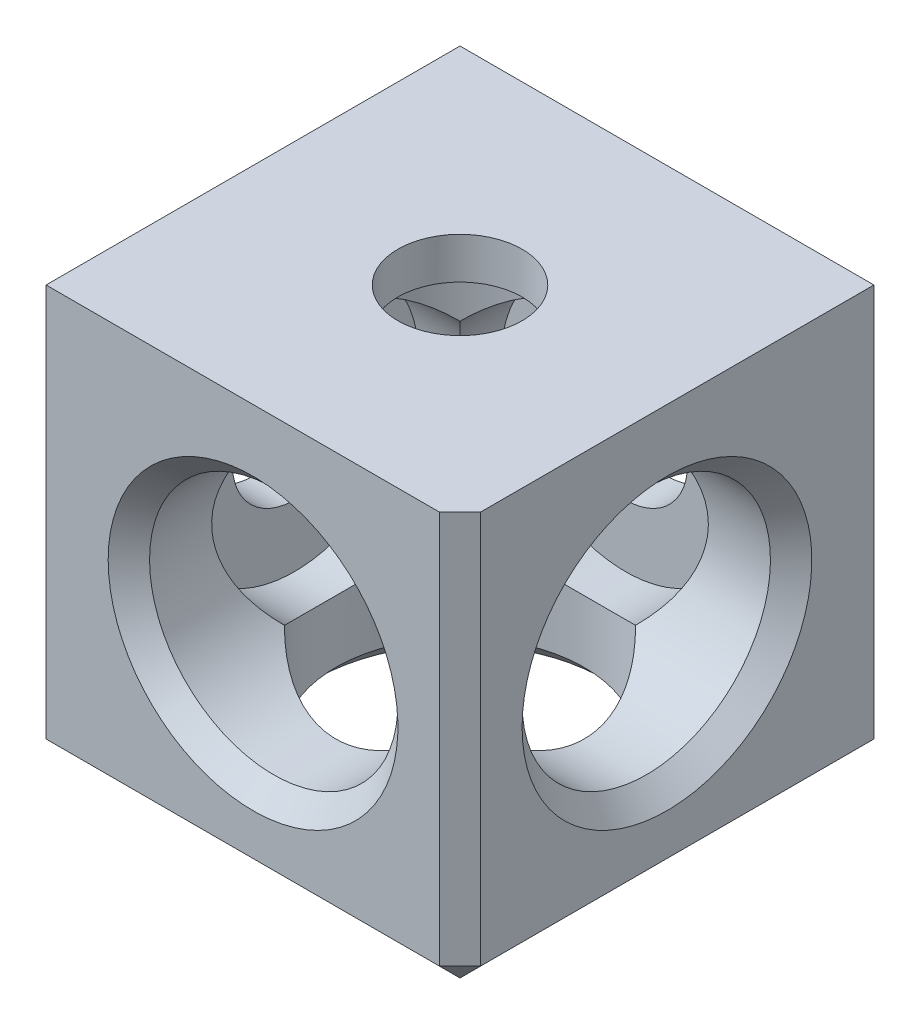
ISO-10303-21;
HEADER;
FILE_DESCRIPTION(('STEP AP214'),'2;1');
FILE_NAME('part.step','',(''),(''),'','','');
FILE_SCHEMA(('AUTOMOTIVE_DESIGN { 1 0 10303 214 1 1 1 1 }'));
ENDSEC;
DATA;
#1=APPLICATION_CONTEXT('core data for automotive mechanical design processes');
#2=APPLICATION_PROTOCOL_DEFINITION('international standard','automotive_design',2000,#1);
#3=PRODUCT_CONTEXT('',#1,'mechanical');
#4=PRODUCT('Part','Part','',(#3));
#5=PRODUCT_RELATED_PRODUCT_CATEGORY('part','',(#4));
#6=PRODUCT_DEFINITION_FORMATION('','',#4);
#7=PRODUCT_DEFINITION_CONTEXT('part definition',#1,'design');
#8=PRODUCT_DEFINITION('design','',#6,#7);
#9=PRODUCT_DEFINITION_SHAPE('','',#8);
#10=(LENGTH_UNIT() NAMED_UNIT(*) SI_UNIT(.MILLI.,.METRE.));
#11=(NAMED_UNIT(*) PLANE_ANGLE_UNIT() SI_UNIT($,.RADIAN.));
#12=(NAMED_UNIT(*) SI_UNIT($,.STERADIAN.) SOLID_ANGLE_UNIT());
#13=UNCERTAINTY_MEASURE_WITH_UNIT(LENGTH_MEASURE(1.E-05),#10,'distance_accuracy_value','');
#14=(GEOMETRIC_REPRESENTATION_CONTEXT(3) GLOBAL_UNCERTAINTY_ASSIGNED_CONTEXT((#13)) GLOBAL_UNIT_ASSIGNED_CONTEXT((#10,
#11,#12)) REPRESENTATION_CONTEXT('',''));
#15=CARTESIAN_POINT('',(0.,0.,0.));
#16=DIRECTION('',(0.,0.,1.));
#17=DIRECTION('',(1.,0.,0.));
#18=AXIS2_PLACEMENT_3D('',#15,#16,#17);
#19=CARTESIAN_POINT('',(0.,-18.4852813742386,10.));
#20=DIRECTION('',(0.,1.,0.));
#21=DIRECTION('',(0.,0.,1.));
#22=AXIS2_PLACEMENT_3D('',#19,#20,#21);
#23=CYLINDRICAL_SURFACE('',#22,3.);
#24=CARTESIAN_POINT('',(0.,10.,10.));
#25=DIRECTION('',(0.,1.,0.));
#26=DIRECTION('',(0.,0.,1.));
#27=AXIS2_PLACEMENT_3D('',#24,#25,#26);
#28=CIRCLE('',#27,3.);
#29=CARTESIAN_POINT('',(0.,10.,13.));
#30=VERTEX_POINT('',#29);
#31=EDGE_CURVE('E325',#30,#30,#28,.T.);
#32=ORIENTED_EDGE('',*,*,#31,.T.);
#33=EDGE_LOOP('',(#32));
#34=FACE_BOUND('',#33,.T.);
#35=CARTESIAN_POINT('',(0.,8.,10.));
#36=DIRECTION('',(0.,-1.,0.));
#37=DIRECTION('',(0.,0.,-1.));
#38=AXIS2_PLACEMENT_3D('',#35,#36,#37);
#39=CIRCLE('',#38,3.);
#40=CARTESIAN_POINT('',(0.,8.,7.));
#41=VERTEX_POINT('',#40);
#42=EDGE_CURVE('E161',#41,#41,#39,.F.);
#43=ORIENTED_EDGE('',*,*,#42,.F.);
#44=EDGE_LOOP('',(#43));
#45=FACE_BOUND('',#44,.T.);
#46=ADVANCED_FACE('F41',(#34,#45),#23,.F.);
#47=CARTESIAN_POINT('',(0.,0.,28.4852813742386));
#48=DIRECTION('',(0.,0.,-1.));
#49=DIRECTION('',(-1.,0.,0.));
#50=AXIS2_PLACEMENT_3D('',#47,#48,#49);
#51=CYLINDRICAL_SURFACE('',#50,3.);
#52=CARTESIAN_POINT('',(0.,0.,0.));
#53=DIRECTION('',(0.,0.,-1.));
#54=DIRECTION('',(-1.,0.,0.));
#55=AXIS2_PLACEMENT_3D('',#52,#53,#54);
#56=CIRCLE('',#55,3.);
#57=CARTESIAN_POINT('',(-3.,0.,0.));
#58=VERTEX_POINT('',#57);
#59=EDGE_CURVE('E330',#58,#58,#56,.T.);
#60=ORIENTED_EDGE('',*,*,#59,.T.);
#61=EDGE_LOOP('',(#60));
#62=FACE_BOUND('',#61,.T.);
#63=CARTESIAN_POINT('',(0.,0.,2.));
#64=DIRECTION('',(0.,0.,1.));
#65=DIRECTION('',(1.,0.,0.));
#66=AXIS2_PLACEMENT_3D('',#63,#64,#65);
#67=CIRCLE('',#66,3.);
#68=CARTESIAN_POINT('',(3.,0.,2.));
#69=VERTEX_POINT('',#68);
#70=EDGE_CURVE('E154',#69,#69,#67,.F.);
#71=ORIENTED_EDGE('',*,*,#70,.F.);
#72=EDGE_LOOP('',(#71));
#73=FACE_BOUND('',#72,.T.);
#74=ADVANCED_FACE('F217',(#62,#73),#51,.F.);
#75=CARTESIAN_POINT('',(-8.,0.,10.));
#76=DIRECTION('',(1.,0.,0.));
#77=DIRECTION('',(0.,0.,-1.));
#78=AXIS2_PLACEMENT_3D('',#75,#76,#77);
#79=CYLINDRICAL_SURFACE('',#78,6.);
#80=CARTESIAN_POINT('',(9.00000000000001,0.,10.));
#81=DIRECTION('',(-1.,0.,0.));
#82=DIRECTION('',(0.,0.,1.));
#83=AXIS2_PLACEMENT_3D('',#80,#81,#82);
#84=CIRCLE('',#83,6.);
#85=CARTESIAN_POINT('',(9.00000000000001,0.,16.));
#86=VERTEX_POINT('',#85);
#87=EDGE_CURVE('E196',#86,#86,#84,.F.);
#88=ORIENTED_EDGE('',*,*,#87,.T.);
#89=EDGE_LOOP('',(#88));
#90=FACE_BOUND('',#89,.T.);
#91=CARTESIAN_POINT('',(0.,0.,10.));
#92=DIRECTION('',(0.707106781186547,0.,-0.707106781186547));
#93=DIRECTION('',(0.707106781186547,0.,0.707106781186547));
#94=AXIS2_PLACEMENT_3D('',#91,#92,#93);
#95=ELLIPSE('',#94,8.48528137423857,6.);
#96=CARTESIAN_POINT('',(4.24264068711929,-4.24264068711928,14.2426406871193));
#97=VERTEX_POINT('',#96);
#98=CARTESIAN_POINT('',(4.24264068711929,4.24264068711928,14.2426406871193));
#99=VERTEX_POINT('',#98);
#100=EDGE_CURVE('E142',#97,#99,#95,.F.);
#101=ORIENTED_EDGE('',*,*,#100,.T.);
#102=CARTESIAN_POINT('',(0.,0.,10.));
#103=DIRECTION('',(0.707106781186547,-0.707106781186547,0.));
#104=DIRECTION('',(0.707106781186547,0.707106781186547,0.));
#105=AXIS2_PLACEMENT_3D('',#102,#103,#104);
#106=ELLIPSE('',#105,8.48528137423857,6.);
#107=CARTESIAN_POINT('',(4.24264068711928,4.24264068711928,5.75735931288071));
#108=VERTEX_POINT('',#107);
#109=EDGE_CURVE('E125',#99,#108,#106,.F.);
#110=ORIENTED_EDGE('',*,*,#109,.T.);
#111=CARTESIAN_POINT('',(0.,0.,10.));
#112=DIRECTION('',(0.707106781186547,0.,0.707106781186547));
#113=DIRECTION('',(0.707106781186547,0.,-0.707106781186547));
#114=AXIS2_PLACEMENT_3D('',#111,#112,#113);
#115=ELLIPSE('',#114,8.48528137423857,6.);
#116=CARTESIAN_POINT('',(4.24264068711928,-4.24264068711928,5.75735931288071));
#117=VERTEX_POINT('',#116);
#118=EDGE_CURVE('E134',#108,#117,#115,.F.);
#119=ORIENTED_EDGE('',*,*,#118,.T.);
#120=CARTESIAN_POINT('',(0.,0.,10.));
#121=DIRECTION('',(0.707106781186547,0.707106781186547,0.));
#122=DIRECTION('',(0.707106781186547,-0.707106781186547,0.));
#123=AXIS2_PLACEMENT_3D('',#120,#121,#122);
#124=ELLIPSE('',#123,8.48528137423857,6.);
#125=EDGE_CURVE('E311',#117,#97,#124,.F.);
#126=ORIENTED_EDGE('',*,*,#125,.T.);
#127=EDGE_LOOP('',(#101,#110,#119,#126));
#128=FACE_BOUND('',#127,.T.);
#129=ADVANCED_FACE('F139',(#90,#128),#79,.F.);
#130=CARTESIAN_POINT('',(-18.4852813742386,0.,10.));
#131=DIRECTION('',(1.,0.,0.));
#132=DIRECTION('',(0.,0.,-1.));
#133=AXIS2_PLACEMENT_3D('',#130,#131,#132);
#134=CYLINDRICAL_SURFACE('',#133,3.);
#135=CARTESIAN_POINT('',(-10.,0.,10.));
#136=DIRECTION('',(1.,0.,0.));
#137=DIRECTION('',(0.,0.,-1.));
#138=AXIS2_PLACEMENT_3D('',#135,#136,#137);
#139=CIRCLE('',#138,3.);
#140=CARTESIAN_POINT('',(-10.,0.,7.));
#141=VERTEX_POINT('',#140);
#142=EDGE_CURVE('E327',#141,#141,#139,.F.);
#143=ORIENTED_EDGE('',*,*,#142,.T.);
#144=EDGE_LOOP('',(#143));
#145=FACE_BOUND('',#144,.T.);
#146=CARTESIAN_POINT('',(-8.,0.,10.));
#147=DIRECTION('',(1.,0.,0.));
#148=DIRECTION('',(0.,0.,-1.));
#149=AXIS2_PLACEMENT_3D('',#146,#147,#148);
#150=CIRCLE('',#149,3.);
#151=CARTESIAN_POINT('',(-8.,0.,7.));
#152=VERTEX_POINT('',#151);
#153=EDGE_CURVE('E324',#152,#152,#150,.F.);
#154=ORIENTED_EDGE('',*,*,#153,.F.);
#155=EDGE_LOOP('',(#154));
#156=FACE_BOUND('',#155,.T.);
#157=ADVANCED_FACE('F233',(#145,#156),#134,.F.);
#158=CARTESIAN_POINT('',(10.,-10.,20.));
#159=DIRECTION('',(-1.,0.,0.));
#160=DIRECTION('',(0.,0.,1.));
#161=AXIS2_PLACEMENT_3D('',#158,#159,#160);
#162=PLANE('',#161);
#163=CARTESIAN_POINT('',(10.,0.,10.));
#164=DIRECTION('',(-1.,0.,0.));
#165=DIRECTION('',(0.,0.,1.));
#166=AXIS2_PLACEMENT_3D('',#163,#164,#165);
#167=CIRCLE('',#166,7.);
#168=CARTESIAN_POINT('',(10.,0.,17.));
#169=VERTEX_POINT('',#168);
#170=EDGE_CURVE('E199',#169,#169,#167,.T.);
#171=ORIENTED_EDGE('',*,*,#170,.T.);
#172=EDGE_LOOP('',(#171));
#173=FACE_BOUND('',#172,.T.);
#174=DIRECTION('',(0.,-1.,0.));
#175=VECTOR('',#174,1.);
#176=CARTESIAN_POINT('',(10.,-10.,19.));
#177=LINE('',#176,#175);
#178=CARTESIAN_POINT('',(10.,10.,19.));
#179=VERTEX_POINT('',#178);
#180=CARTESIAN_POINT('',(10.,-9.,19.));
#181=VERTEX_POINT('',#180);
#182=EDGE_CURVE('E57',#179,#181,#177,.T.);
#183=ORIENTED_EDGE('',*,*,#182,.T.);
#184=DIRECTION('',(0.,0.,-1.));
#185=VECTOR('',#184,1.);
#186=CARTESIAN_POINT('',(10.,-9.,20.));
#187=LINE('',#186,#185);
#188=CARTESIAN_POINT('',(10.,-9.,0.));
#189=VERTEX_POINT('',#188);
#190=EDGE_CURVE('E176',#181,#189,#187,.T.);
#191=ORIENTED_EDGE('',*,*,#190,.T.);
#192=DIRECTION('',(0.,1.,0.));
#193=VECTOR('',#192,1.);
#194=CARTESIAN_POINT('',(10.,-10.,0.));
#195=LINE('',#194,#193);
#196=CARTESIAN_POINT('',(10.,10.,0.));
#197=VERTEX_POINT('',#196);
#198=EDGE_CURVE('E333',#189,#197,#195,.T.);
#199=ORIENTED_EDGE('',*,*,#198,.T.);
#200=DIRECTION('',(0.,0.,-1.));
#201=VECTOR('',#200,1.);
#202=CARTESIAN_POINT('',(10.,10.,20.));
#203=LINE('',#202,#201);
#204=EDGE_CURVE('E354',#179,#197,#203,.T.);
#205=ORIENTED_EDGE('',*,*,#204,.F.);
#206=EDGE_LOOP('',(#183,#191,#199,#205));
#207=FACE_BOUND('',#206,.T.);
#208=ADVANCED_FACE('F235',(#173,#207),#162,.F.);
#209=CARTESIAN_POINT('',(-10.,10.,20.));
#210=DIRECTION('',(0.,-1.,0.));
#211=DIRECTION('',(0.,0.,-1.));
#212=AXIS2_PLACEMENT_3D('',#209,#210,#211);
#213=PLANE('',#212);
#214=ORIENTED_EDGE('',*,*,#31,.F.);
#215=EDGE_LOOP('',(#214));
#216=FACE_BOUND('',#215,.T.);
#217=DIRECTION('',(-1.,0.,0.));
#218=VECTOR('',#217,1.);
#219=CARTESIAN_POINT('',(-10.,10.,20.));
#220=LINE('',#219,#218);
#221=CARTESIAN_POINT('',(9.00000000000001,10.,20.));
#222=VERTEX_POINT('',#221);
#223=CARTESIAN_POINT('',(-10.,10.,20.));
#224=VERTEX_POINT('',#223);
#225=EDGE_CURVE('E334',#222,#224,#220,.T.);
#226=ORIENTED_EDGE('',*,*,#225,.F.);
#227=DIRECTION('',(-0.707106781186545,0.,0.70710678118655));
#228=VECTOR('',#227,1.);
#229=CARTESIAN_POINT('',(9.00000000000001,10.,20.));
#230=LINE('',#229,#228);
#231=EDGE_CURVE('E65',#222,#179,#230,.F.);
#232=ORIENTED_EDGE('',*,*,#231,.T.);
#233=ORIENTED_EDGE('',*,*,#204,.T.);
#234=DIRECTION('',(-1.,0.,0.));
#235=VECTOR('',#234,1.);
#236=CARTESIAN_POINT('',(-10.,10.,0.));
#237=LINE('',#236,#235);
#238=CARTESIAN_POINT('',(-10.,10.,0.));
#239=VERTEX_POINT('',#238);
#240=EDGE_CURVE('E343',#197,#239,#237,.T.);
#241=ORIENTED_EDGE('',*,*,#240,.T.);
#242=DIRECTION('',(0.,0.,-1.));
#243=VECTOR('',#242,1.);
#244=CARTESIAN_POINT('',(-10.,10.,20.));
#245=LINE('',#244,#243);
#246=EDGE_CURVE('E351',#224,#239,#245,.T.);
#247=ORIENTED_EDGE('',*,*,#246,.F.);
#248=EDGE_LOOP('',(#226,#232,#233,#241,#247));
#249=FACE_BOUND('',#248,.T.);
#250=ADVANCED_FACE('F254',(#216,#249),#213,.F.);
#251=CARTESIAN_POINT('',(-10.,-10.,20.));
#252=DIRECTION('',(1.,0.,0.));
#253=DIRECTION('',(0.,0.,-1.));
#254=AXIS2_PLACEMENT_3D('',#251,#252,#253);
#255=PLANE('',#254);
#256=ORIENTED_EDGE('',*,*,#142,.F.);
#257=EDGE_LOOP('',(#256));
#258=FACE_BOUND('',#257,.T.);
#259=DIRECTION('',(0.,0.,-1.));
#260=VECTOR('',#259,1.);
#261=CARTESIAN_POINT('',(-10.,-10.,20.));
#262=LINE('',#261,#260);
#263=CARTESIAN_POINT('',(-10.,-10.,19.));
#264=VERTEX_POINT('',#263);
#265=CARTESIAN_POINT('',(-10.,-10.,0.));
#266=VERTEX_POINT('',#265);
#267=EDGE_CURVE('E340',#264,#266,#262,.T.);
#268=ORIENTED_EDGE('',*,*,#267,.F.);
#269=DIRECTION('',(0.,-0.707106781186545,-0.70710678118655));
#270=VECTOR('',#269,1.);
#271=CARTESIAN_POINT('',(-10.,-9.,20.));
#272=LINE('',#271,#270);
#273=CARTESIAN_POINT('',(-10.,-9.,20.));
#274=VERTEX_POINT('',#273);
#275=EDGE_CURVE('E173',#264,#274,#272,.F.);
#276=ORIENTED_EDGE('',*,*,#275,.T.);
#277=DIRECTION('',(0.,-1.,0.));
#278=VECTOR('',#277,1.);
#279=CARTESIAN_POINT('',(-10.,-10.,20.));
#280=LINE('',#279,#278);
#281=EDGE_CURVE('E336',#224,#274,#280,.T.);
#282=ORIENTED_EDGE('',*,*,#281,.F.);
#283=ORIENTED_EDGE('',*,*,#246,.T.);
#284=DIRECTION('',(0.,-1.,0.));
#285=VECTOR('',#284,1.);
#286=CARTESIAN_POINT('',(-10.,-10.,0.));
#287=LINE('',#286,#285);
#288=EDGE_CURVE('E345',#239,#266,#287,.T.);
#289=ORIENTED_EDGE('',*,*,#288,.T.);
#290=EDGE_LOOP('',(#268,#276,#282,#283,#289));
#291=FACE_BOUND('',#290,.T.);
#292=ADVANCED_FACE('F250',(#258,#291),#255,.F.);
#293=CARTESIAN_POINT('',(-10.,-10.,20.));
#294=DIRECTION('',(0.,1.,0.));
#295=DIRECTION('',(0.,0.,1.));
#296=AXIS2_PLACEMENT_3D('',#293,#294,#295);
#297=PLANE('',#296);
#298=CARTESIAN_POINT('',(0.,-10.,10.));
#299=DIRECTION('',(0.,1.,0.));
#300=DIRECTION('',(0.,0.,1.));
#301=AXIS2_PLACEMENT_3D('',#298,#299,#300);
#302=CIRCLE('',#301,7.00000000000001);
#303=CARTESIAN_POINT('',(0.,-10.,17.));
#304=VERTEX_POINT('',#303);
#305=EDGE_CURVE('E193',#304,#304,#302,.T.);
#306=ORIENTED_EDGE('',*,*,#305,.T.);
#307=EDGE_LOOP('',(#306));
#308=FACE_BOUND('',#307,.T.);
#309=DIRECTION('',(0.,0.,1.));
#310=VECTOR('',#309,1.);
#311=CARTESIAN_POINT('',(9.00000000000001,-10.,20.));
#312=LINE('',#311,#310);
#313=CARTESIAN_POINT('',(9.00000000000001,-10.,0.));
#314=VERTEX_POINT('',#313);
#315=CARTESIAN_POINT('',(9.00000000000001,-10.,19.));
#316=VERTEX_POINT('',#315);
#317=EDGE_CURVE('E169',#314,#316,#312,.T.);
#318=ORIENTED_EDGE('',*,*,#317,.T.);
#319=DIRECTION('',(-1.,0.,0.));
#320=VECTOR('',#319,1.);
#321=CARTESIAN_POINT('',(-10.,-10.,19.));
#322=LINE('',#321,#320);
#323=EDGE_CURVE('E171',#316,#264,#322,.T.);
#324=ORIENTED_EDGE('',*,*,#323,.T.);
#325=ORIENTED_EDGE('',*,*,#267,.T.);
#326=DIRECTION('',(1.,0.,0.));
#327=VECTOR('',#326,1.);
#328=CARTESIAN_POINT('',(-10.,-10.,0.));
#329=LINE('',#328,#327);
#330=EDGE_CURVE('E337',#266,#314,#329,.T.);
#331=ORIENTED_EDGE('',*,*,#330,.T.);
#332=EDGE_LOOP('',(#318,#324,#325,#331));
#333=FACE_BOUND('',#332,.T.);
#334=ADVANCED_FACE('F242',(#308,#333),#297,.F.);
#335=CARTESIAN_POINT('',(0.,0.,20.));
#336=DIRECTION('',(0.,0.,-1.));
#337=DIRECTION('',(-1.,0.,0.));
#338=AXIS2_PLACEMENT_3D('',#335,#336,#337);
#339=PLANE('',#338);
#340=CARTESIAN_POINT('',(0.,0.,20.));
#341=DIRECTION('',(0.,0.,-1.));
#342=DIRECTION('',(-1.,0.,0.));
#343=AXIS2_PLACEMENT_3D('',#340,#341,#342);
#344=CIRCLE('',#343,7.);
#345=CARTESIAN_POINT('',(-7.,0.,20.));
#346=VERTEX_POINT('',#345);
#347=EDGE_CURVE('E11',#346,#346,#344,.T.);
#348=ORIENTED_EDGE('',*,*,#347,.T.);
#349=EDGE_LOOP('',(#348));
#350=FACE_BOUND('',#349,.T.);
#351=ORIENTED_EDGE('',*,*,#281,.T.);
#352=DIRECTION('',(1.,0.,0.));
#353=VECTOR('',#352,1.);
#354=CARTESIAN_POINT('',(0.,-9.,20.));
#355=LINE('',#354,#353);
#356=CARTESIAN_POINT('',(9.00000000000001,-9.,20.));
#357=VERTEX_POINT('',#356);
#358=EDGE_CURVE('E166',#274,#357,#355,.T.);
#359=ORIENTED_EDGE('',*,*,#358,.T.);
#360=DIRECTION('',(0.,1.,0.));
#361=VECTOR('',#360,1.);
#362=CARTESIAN_POINT('',(9.00000000000001,0.,20.));
#363=LINE('',#362,#361);
#364=EDGE_CURVE('E160',#357,#222,#363,.T.);
#365=ORIENTED_EDGE('',*,*,#364,.T.);
#366=ORIENTED_EDGE('',*,*,#225,.T.);
#367=EDGE_LOOP('',(#351,#359,#365,#366));
#368=FACE_BOUND('',#367,.T.);
#369=ADVANCED_FACE('F238',(#350,#368),#339,.F.);
#370=CARTESIAN_POINT('',(0.,0.,0.));
#371=DIRECTION('',(0.,0.,-1.));
#372=DIRECTION('',(-1.,0.,0.));
#373=AXIS2_PLACEMENT_3D('',#370,#371,#372);
#374=PLANE('',#373);
#375=ORIENTED_EDGE('',*,*,#59,.F.);
#376=EDGE_LOOP('',(#375));
#377=FACE_BOUND('',#376,.T.);
#378=ORIENTED_EDGE('',*,*,#198,.F.);
#379=DIRECTION('',(0.707106781186545,0.70710678118655,0.));
#380=VECTOR('',#379,1.);
#381=CARTESIAN_POINT('',(9.50000000000003,-9.49999999999997,0.));
#382=LINE('',#381,#380);
#383=EDGE_CURVE('E178',#189,#314,#382,.F.);
#384=ORIENTED_EDGE('',*,*,#383,.T.);
#385=ORIENTED_EDGE('',*,*,#330,.F.);
#386=ORIENTED_EDGE('',*,*,#288,.F.);
#387=ORIENTED_EDGE('',*,*,#240,.F.);
#388=EDGE_LOOP('',(#378,#384,#385,#386,#387));
#389=FACE_BOUND('',#388,.T.);
#390=ADVANCED_FACE('F241',(#377,#389),#374,.T.);
#391=CARTESIAN_POINT('',(-8.,0.,10.));
#392=DIRECTION('',(1.,0.,0.));
#393=DIRECTION('',(0.,0.,-1.));
#394=AXIS2_PLACEMENT_3D('',#391,#392,#393);
#395=PLANE('',#394);
#396=CARTESIAN_POINT('',(-8.,0.,10.));
#397=DIRECTION('',(1.,0.,0.));
#398=DIRECTION('',(0.,0.,-1.));
#399=AXIS2_PLACEMENT_3D('',#396,#397,#398);
#400=CIRCLE('',#399,6.);
#401=CARTESIAN_POINT('',(-8.,0.,4.));
#402=VERTEX_POINT('',#401);
#403=EDGE_CURVE('E156',#402,#402,#400,.T.);
#404=ORIENTED_EDGE('',*,*,#403,.T.);
#405=EDGE_LOOP('',(#404));
#406=FACE_BOUND('',#405,.T.);
#407=ORIENTED_EDGE('',*,*,#153,.T.);
#408=EDGE_LOOP('',(#407));
#409=FACE_BOUND('',#408,.T.);
#410=ADVANCED_FACE('F246',(#406,#409),#395,.T.);
#411=ORIENTED_EDGE('',*,*,#403,.F.);
#412=EDGE_LOOP('',(#411));
#413=FACE_BOUND('',#412,.T.);
#414=CARTESIAN_POINT('',(0.,0.,10.));
#415=DIRECTION('',(0.707106781186547,0.,0.707106781186547));
#416=DIRECTION('',(0.707106781186547,0.,-0.707106781186547));
#417=AXIS2_PLACEMENT_3D('',#414,#415,#416);
#418=ELLIPSE('',#417,8.48528137423857,6.);
#419=CARTESIAN_POINT('',(-4.24264068711928,4.24264068711929,14.2426406871193));
#420=VERTEX_POINT('',#419);
#421=CARTESIAN_POINT('',(-4.24264068711928,-4.24264068711929,14.2426406871193));
#422=VERTEX_POINT('',#421);
#423=EDGE_CURVE('E147',#420,#422,#418,.T.);
#424=ORIENTED_EDGE('',*,*,#423,.T.);
#425=CARTESIAN_POINT('',(0.,0.,10.));
#426=DIRECTION('',(0.707106781186547,-0.707106781186547,0.));
#427=DIRECTION('',(0.707106781186547,0.707106781186547,0.));
#428=AXIS2_PLACEMENT_3D('',#425,#426,#427);
#429=ELLIPSE('',#428,8.48528137423857,6.);
#430=CARTESIAN_POINT('',(-4.24264068711928,-4.24264068711928,5.75735931288072));
#431=VERTEX_POINT('',#430);
#432=EDGE_CURVE('E314',#422,#431,#429,.T.);
#433=ORIENTED_EDGE('',*,*,#432,.T.);
#434=CARTESIAN_POINT('',(0.,0.,10.));
#435=DIRECTION('',(0.707106781186547,0.,-0.707106781186547));
#436=DIRECTION('',(0.707106781186547,0.,0.707106781186547));
#437=AXIS2_PLACEMENT_3D('',#434,#435,#436);
#438=ELLIPSE('',#437,8.48528137423857,6.);
#439=CARTESIAN_POINT('',(-4.24264068711928,4.24264068711928,5.75735931288072));
#440=VERTEX_POINT('',#439);
#441=EDGE_CURVE('E150',#431,#440,#438,.T.);
#442=ORIENTED_EDGE('',*,*,#441,.T.);
#443=CARTESIAN_POINT('',(0.,0.,10.));
#444=DIRECTION('',(0.707106781186547,0.707106781186547,0.));
#445=DIRECTION('',(0.707106781186547,-0.707106781186547,0.));
#446=AXIS2_PLACEMENT_3D('',#443,#444,#445);
#447=ELLIPSE('',#446,8.48528137423857,6.);
#448=EDGE_CURVE('E128',#440,#420,#447,.T.);
#449=ORIENTED_EDGE('',*,*,#448,.T.);
#450=EDGE_LOOP('',(#424,#433,#442,#449));
#451=FACE_BOUND('',#450,.T.);
#452=ADVANCED_FACE('F231',(#413,#451),#79,.F.);
#453=CARTESIAN_POINT('',(0.,0.,2.));
#454=DIRECTION('',(0.,0.,1.));
#455=DIRECTION('',(1.,0.,0.));
#456=AXIS2_PLACEMENT_3D('',#453,#454,#455);
#457=CYLINDRICAL_SURFACE('',#456,6.);
#458=CARTESIAN_POINT('',(0.,0.,19.));
#459=DIRECTION('',(0.,0.,-1.));
#460=DIRECTION('',(-1.,0.,0.));
#461=AXIS2_PLACEMENT_3D('',#458,#459,#460);
#462=CIRCLE('',#461,6.);
#463=CARTESIAN_POINT('',(-6.,0.,19.));
#464=VERTEX_POINT('',#463);
#465=EDGE_CURVE('E50',#464,#464,#462,.F.);
#466=ORIENTED_EDGE('',*,*,#465,.T.);
#467=EDGE_LOOP('',(#466));
#468=FACE_BOUND('',#467,.T.);
#469=ORIENTED_EDGE('',*,*,#423,.F.);
#470=CARTESIAN_POINT('',(0.,0.,10.));
#471=DIRECTION('',(0.,-0.707106781186547,0.707106781186547));
#472=DIRECTION('',(0.,0.707106781186547,0.707106781186547));
#473=AXIS2_PLACEMENT_3D('',#470,#471,#472);
#474=ELLIPSE('',#473,8.48528137423857,6.);
#475=EDGE_CURVE('E143',#420,#99,#474,.F.);
#476=ORIENTED_EDGE('',*,*,#475,.T.);
#477=ORIENTED_EDGE('',*,*,#100,.F.);
#478=CARTESIAN_POINT('',(0.,0.,10.));
#479=DIRECTION('',(0.,0.707106781186547,0.707106781186547));
#480=DIRECTION('',(0.,-0.707106781186547,0.707106781186547));
#481=AXIS2_PLACEMENT_3D('',#478,#479,#480);
#482=ELLIPSE('',#481,8.48528137423857,6.);
#483=EDGE_CURVE('E164',#97,#422,#482,.F.);
#484=ORIENTED_EDGE('',*,*,#483,.T.);
#485=EDGE_LOOP('',(#469,#476,#477,#484));
#486=FACE_BOUND('',#485,.T.);
#487=ADVANCED_FACE('F204',(#468,#486),#457,.F.);
#488=CARTESIAN_POINT('',(0.,0.,2.));
#489=DIRECTION('',(0.,0.,1.));
#490=DIRECTION('',(1.,0.,0.));
#491=AXIS2_PLACEMENT_3D('',#488,#489,#490);
#492=PLANE('',#491);
#493=CARTESIAN_POINT('',(0.,0.,2.));
#494=DIRECTION('',(0.,0.,1.));
#495=DIRECTION('',(1.,0.,0.));
#496=AXIS2_PLACEMENT_3D('',#493,#494,#495);
#497=CIRCLE('',#496,6.);
#498=CARTESIAN_POINT('',(6.,0.,2.));
#499=VERTEX_POINT('',#498);
#500=EDGE_CURVE('E157',#499,#499,#497,.T.);
#501=ORIENTED_EDGE('',*,*,#500,.T.);
#502=EDGE_LOOP('',(#501));
#503=FACE_BOUND('',#502,.T.);
#504=ORIENTED_EDGE('',*,*,#70,.T.);
#505=EDGE_LOOP('',(#504));
#506=FACE_BOUND('',#505,.T.);
#507=ADVANCED_FACE('F373',(#503,#506),#492,.T.);
#508=ORIENTED_EDGE('',*,*,#500,.F.);
#509=EDGE_LOOP('',(#508));
#510=FACE_BOUND('',#509,.T.);
#511=ORIENTED_EDGE('',*,*,#441,.F.);
#512=CARTESIAN_POINT('',(0.,0.,10.));
#513=DIRECTION('',(0.,-0.707106781186547,0.707106781186547));
#514=DIRECTION('',(0.,0.707106781186547,0.707106781186547));
#515=AXIS2_PLACEMENT_3D('',#512,#513,#514);
#516=ELLIPSE('',#515,8.48528137423857,6.);
#517=EDGE_CURVE('E133',#431,#117,#516,.T.);
#518=ORIENTED_EDGE('',*,*,#517,.T.);
#519=ORIENTED_EDGE('',*,*,#118,.F.);
#520=CARTESIAN_POINT('',(0.,0.,10.));
#521=DIRECTION('',(0.,0.707106781186547,0.707106781186547));
#522=DIRECTION('',(0.,-0.707106781186547,0.707106781186547));
#523=AXIS2_PLACEMENT_3D('',#520,#521,#522);
#524=ELLIPSE('',#523,8.48528137423857,6.);
#525=EDGE_CURVE('E122',#108,#440,#524,.T.);
#526=ORIENTED_EDGE('',*,*,#525,.T.);
#527=EDGE_LOOP('',(#511,#518,#519,#526));
#528=FACE_BOUND('',#527,.T.);
#529=ADVANCED_FACE('F146',(#510,#528),#457,.F.);
#530=CARTESIAN_POINT('',(0.,8.,10.));
#531=DIRECTION('',(0.,-1.,0.));
#532=DIRECTION('',(0.,0.,-1.));
#533=AXIS2_PLACEMENT_3D('',#530,#531,#532);
#534=CYLINDRICAL_SURFACE('',#533,6.);
#535=CARTESIAN_POINT('',(0.,8.,10.));
#536=DIRECTION('',(0.,-1.,0.));
#537=DIRECTION('',(0.,0.,-1.));
#538=AXIS2_PLACEMENT_3D('',#535,#536,#537);
#539=CIRCLE('',#538,6.);
#540=CARTESIAN_POINT('',(0.,8.,4.));
#541=VERTEX_POINT('',#540);
#542=EDGE_CURVE('E190',#541,#541,#539,.T.);
#543=ORIENTED_EDGE('',*,*,#542,.F.);
#544=EDGE_LOOP('',(#543));
#545=FACE_BOUND('',#544,.T.);
#546=ORIENTED_EDGE('',*,*,#448,.F.);
#547=ORIENTED_EDGE('',*,*,#525,.F.);
#548=ORIENTED_EDGE('',*,*,#109,.F.);
#549=ORIENTED_EDGE('',*,*,#475,.F.);
#550=EDGE_LOOP('',(#546,#547,#548,#549));
#551=FACE_BOUND('',#550,.T.);
#552=ADVANCED_FACE('F124',(#545,#551),#534,.F.);
#553=CARTESIAN_POINT('',(0.,8.,10.));
#554=DIRECTION('',(0.,-1.,0.));
#555=DIRECTION('',(0.,0.,-1.));
#556=AXIS2_PLACEMENT_3D('',#553,#554,#555);
#557=PLANE('',#556);
#558=ORIENTED_EDGE('',*,*,#542,.T.);
#559=EDGE_LOOP('',(#558));
#560=FACE_BOUND('',#559,.T.);
#561=ORIENTED_EDGE('',*,*,#42,.T.);
#562=EDGE_LOOP('',(#561));
#563=FACE_BOUND('',#562,.T.);
#564=ADVANCED_FACE('F309',(#560,#563),#557,.T.);
#565=CARTESIAN_POINT('',(0.,-9.,10.));
#566=DIRECTION('',(0.,1.,0.));
#567=DIRECTION('',(0.,0.,1.));
#568=AXIS2_PLACEMENT_3D('',#565,#566,#567);
#569=CIRCLE('',#568,6.);
#570=CARTESIAN_POINT('',(0.,-9.,16.));
#571=VERTEX_POINT('',#570);
#572=EDGE_CURVE('E181',#571,#571,#569,.F.);
#573=ORIENTED_EDGE('',*,*,#572,.T.);
#574=EDGE_LOOP('',(#573));
#575=FACE_BOUND('',#574,.T.);
#576=ORIENTED_EDGE('',*,*,#125,.F.);
#577=ORIENTED_EDGE('',*,*,#517,.F.);
#578=ORIENTED_EDGE('',*,*,#432,.F.);
#579=ORIENTED_EDGE('',*,*,#483,.F.);
#580=EDGE_LOOP('',(#576,#577,#578,#579));
#581=FACE_BOUND('',#580,.T.);
#582=ADVANCED_FACE('F290',(#575,#581),#534,.F.);
#583=CARTESIAN_POINT('',(9.00000000000001,0.,20.));
#584=DIRECTION('',(-0.70710678118655,0.,-0.707106781186545));
#585=DIRECTION('',(0.,1.,0.));
#586=AXIS2_PLACEMENT_3D('',#583,#584,#585);
#587=PLANE('',#586);
#588=ORIENTED_EDGE('',*,*,#231,.F.);
#589=ORIENTED_EDGE('',*,*,#364,.F.);
#590=DIRECTION('',(0.707106781186545,0.,-0.70710678118655));
#591=VECTOR('',#590,1.);
#592=CARTESIAN_POINT('',(9.00000000000001,-9.,20.));
#593=LINE('',#592,#591);
#594=EDGE_CURVE('E187',#181,#357,#593,.F.);
#595=ORIENTED_EDGE('',*,*,#594,.F.);
#596=ORIENTED_EDGE('',*,*,#182,.F.);
#597=EDGE_LOOP('',(#588,#589,#595,#596));
#598=FACE_BOUND('',#597,.T.);
#599=ADVANCED_FACE('F284',(#598),#587,.F.);
#600=CARTESIAN_POINT('',(10.,-9.,20.));
#601=DIRECTION('',(-0.70710678118655,0.707106781186545,0.));
#602=DIRECTION('',(0.,0.,-1.));
#603=AXIS2_PLACEMENT_3D('',#600,#601,#602);
#604=PLANE('',#603);
#605=ORIENTED_EDGE('',*,*,#383,.F.);
#606=ORIENTED_EDGE('',*,*,#190,.F.);
#607=DIRECTION('',(-0.707106781186545,-0.70710678118655,0.));
#608=VECTOR('',#607,1.);
#609=CARTESIAN_POINT('',(9.5,-9.5,19.));
#610=LINE('',#609,#608);
#611=EDGE_CURVE('E184',#316,#181,#610,.F.);
#612=ORIENTED_EDGE('',*,*,#611,.F.);
#613=ORIENTED_EDGE('',*,*,#317,.F.);
#614=EDGE_LOOP('',(#605,#606,#612,#613));
#615=FACE_BOUND('',#614,.T.);
#616=ADVANCED_FACE('F277',(#615),#604,.F.);
#617=CARTESIAN_POINT('',(9.00000000000001,-9.,20.));
#618=DIRECTION('',(0.57735026918963,-0.577350269189626,0.577350269189622));
#619=DIRECTION('',(0.707106781186545,0.70710678118655,0.));
#620=AXIS2_PLACEMENT_3D('',#617,#618,#619);
#621=PLANE('',#620);
#622=ORIENTED_EDGE('',*,*,#611,.T.);
#623=ORIENTED_EDGE('',*,*,#594,.T.);
#624=DIRECTION('',(0.,0.707106781186545,0.70710678118655));
#625=VECTOR('',#624,1.);
#626=CARTESIAN_POINT('',(9.00000000000001,-9.,20.));
#627=LINE('',#626,#625);
#628=EDGE_CURVE('E182',#316,#357,#627,.T.);
#629=ORIENTED_EDGE('',*,*,#628,.F.);
#630=EDGE_LOOP('',(#622,#623,#629));
#631=FACE_BOUND('',#630,.T.);
#632=ADVANCED_FACE('F270',(#631),#621,.T.);
#633=CARTESIAN_POINT('',(0.,-9.,20.));
#634=DIRECTION('',(0.,0.70710678118655,-0.707106781186545));
#635=DIRECTION('',(1.,0.,0.));
#636=AXIS2_PLACEMENT_3D('',#633,#634,#635);
#637=PLANE('',#636);
#638=ORIENTED_EDGE('',*,*,#275,.F.);
#639=ORIENTED_EDGE('',*,*,#323,.F.);
#640=ORIENTED_EDGE('',*,*,#628,.T.);
#641=ORIENTED_EDGE('',*,*,#358,.F.);
#642=EDGE_LOOP('',(#638,#639,#640,#641));
#643=FACE_BOUND('',#642,.T.);
#644=ADVANCED_FACE('F263',(#643),#637,.F.);
#645=CARTESIAN_POINT('',(0.,-9.,10.));
#646=DIRECTION('',(0.,-1.,0.));
#647=DIRECTION('',(0.,0.,-1.));
#648=AXIS2_PLACEMENT_3D('',#645,#646,#647);
#649=CONICAL_SURFACE('',#648,6.,0.785398163397453);
#650=ORIENTED_EDGE('',*,*,#305,.F.);
#651=EDGE_LOOP('',(#650));
#652=FACE_BOUND('',#651,.T.);
#653=ORIENTED_EDGE('',*,*,#572,.F.);
#654=EDGE_LOOP('',(#653));
#655=FACE_BOUND('',#654,.T.);
#656=ADVANCED_FACE('F213',(#652,#655),#649,.F.);
#657=CARTESIAN_POINT('',(9.00000000000001,0.,10.));
#658=DIRECTION('',(1.,0.,0.));
#659=DIRECTION('',(0.,0.,-1.));
#660=AXIS2_PLACEMENT_3D('',#657,#658,#659);
#661=CONICAL_SURFACE('',#660,6.,0.785398163397451);
#662=ORIENTED_EDGE('',*,*,#170,.F.);
#663=EDGE_LOOP('',(#662));
#664=FACE_BOUND('',#663,.T.);
#665=ORIENTED_EDGE('',*,*,#87,.F.);
#666=EDGE_LOOP('',(#665));
#667=FACE_BOUND('',#666,.T.);
#668=ADVANCED_FACE('F208',(#664,#667),#661,.F.);
#669=CARTESIAN_POINT('',(0.,0.,19.));
#670=DIRECTION('',(0.,0.,1.));
#671=DIRECTION('',(1.,0.,0.));
#672=AXIS2_PLACEMENT_3D('',#669,#670,#671);
#673=CONICAL_SURFACE('',#672,6.,0.785398163397449);
#674=ORIENTED_EDGE('',*,*,#347,.F.);
#675=EDGE_LOOP('',(#674));
#676=FACE_BOUND('',#675,.T.);
#677=ORIENTED_EDGE('',*,*,#465,.F.);
#678=EDGE_LOOP('',(#677));
#679=FACE_BOUND('',#678,.T.);
#680=ADVANCED_FACE('F44',(#676,#679),#673,.F.);
#681=CLOSED_SHELL('',(#46,#74,#129,#157,#208,#250,#292,#334,#369,#390,#410,#452,#487,#507,#529,
#552,#564,#582,#599,#616,#632,#644,#656,#668,#680));
#682=MANIFOLD_SOLID_BREP('B2',#681);
#683=ADVANCED_BREP_SHAPE_REPRESENTATION('',(#18,#682),#14);
#684=SHAPE_DEFINITION_REPRESENTATION(#9,#683);
ENDSEC;
END-ISO-10303-21;
